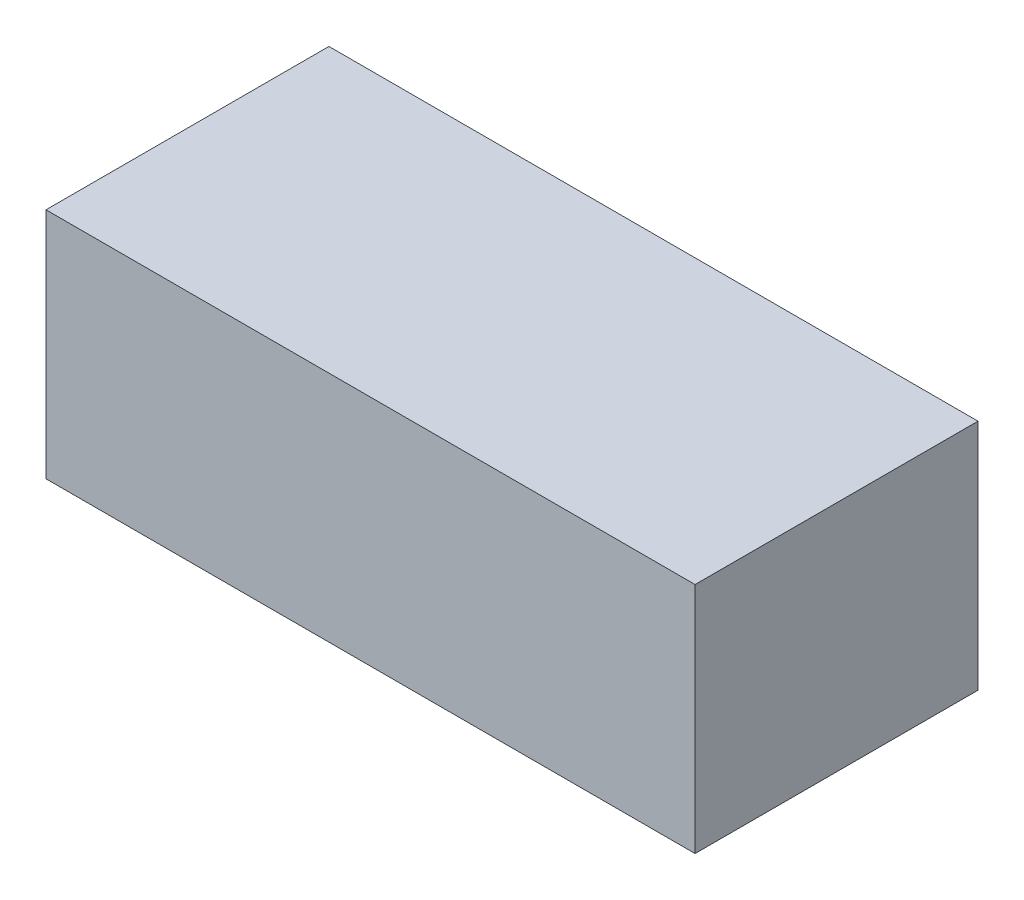
ISO-10303-21;
HEADER;
FILE_DESCRIPTION(('STEP AP214'),'2;1');
FILE_NAME('part.step','',(''),(''),'','','');
FILE_SCHEMA(('AUTOMOTIVE_DESIGN { 1 0 10303 214 1 1 1 1 }'));
ENDSEC;
DATA;
#1=APPLICATION_CONTEXT('core data for automotive mechanical design processes');
#2=APPLICATION_PROTOCOL_DEFINITION('international standard','automotive_design',2000,#1);
#3=PRODUCT_CONTEXT('',#1,'mechanical');
#4=PRODUCT('Part','Part','',(#3));
#5=PRODUCT_RELATED_PRODUCT_CATEGORY('part','',(#4));
#6=PRODUCT_DEFINITION_FORMATION('','',#4);
#7=PRODUCT_DEFINITION_CONTEXT('part definition',#1,'design');
#8=PRODUCT_DEFINITION('design','',#6,#7);
#9=PRODUCT_DEFINITION_SHAPE('','',#8);
#10=(LENGTH_UNIT() NAMED_UNIT(*) SI_UNIT(.MILLI.,.METRE.));
#11=(NAMED_UNIT(*) PLANE_ANGLE_UNIT() SI_UNIT($,.RADIAN.));
#12=(NAMED_UNIT(*) SI_UNIT($,.STERADIAN.) SOLID_ANGLE_UNIT());
#13=UNCERTAINTY_MEASURE_WITH_UNIT(LENGTH_MEASURE(1.E-05),#10,'distance_accuracy_value','');
#14=(GEOMETRIC_REPRESENTATION_CONTEXT(3) GLOBAL_UNCERTAINTY_ASSIGNED_CONTEXT((#13)) GLOBAL_UNIT_ASSIGNED_CONTEXT((#10,
#11,#12)) REPRESENTATION_CONTEXT('',''));
#15=CARTESIAN_POINT('',(0.,0.,0.));
#16=DIRECTION('',(0.,0.,1.));
#17=DIRECTION('',(1.,0.,0.));
#18=AXIS2_PLACEMENT_3D('',#15,#16,#17);
#19=CARTESIAN_POINT('',(-39.,28.,17.));
#20=DIRECTION('',(1.,0.,0.));
#21=DIRECTION('',(0.,0.,-1.));
#22=AXIS2_PLACEMENT_3D('',#19,#20,#21);
#23=PLANE('',#22);
#24=DIRECTION('',(0.,0.,1.));
#25=VECTOR('',#24,1.);
#26=CARTESIAN_POINT('',(-39.,0.,17.));
#27=LINE('',#26,#25);
#28=CARTESIAN_POINT('',(-39.,0.,-17.));
#29=VERTEX_POINT('',#28);
#30=CARTESIAN_POINT('',(-39.,0.,17.));
#31=VERTEX_POINT('',#30);
#32=EDGE_CURVE('E102',#29,#31,#27,.T.);
#33=ORIENTED_EDGE('',*,*,#32,.T.);
#34=DIRECTION('',(0.,-1.,0.));
#35=VECTOR('',#34,1.);
#36=CARTESIAN_POINT('',(-39.,28.,17.));
#37=LINE('',#36,#35);
#38=CARTESIAN_POINT('',(-39.,28.,17.));
#39=VERTEX_POINT('',#38);
#40=EDGE_CURVE('E11',#39,#31,#37,.T.);
#41=ORIENTED_EDGE('',*,*,#40,.F.);
#42=DIRECTION('',(0.,0.,1.));
#43=VECTOR('',#42,1.);
#44=CARTESIAN_POINT('',(-39.,28.,17.));
#45=LINE('',#44,#43);
#46=CARTESIAN_POINT('',(-39.,28.,-17.));
#47=VERTEX_POINT('',#46);
#48=EDGE_CURVE('E90',#47,#39,#45,.T.);
#49=ORIENTED_EDGE('',*,*,#48,.F.);
#50=DIRECTION('',(0.,-1.,0.));
#51=VECTOR('',#50,1.);
#52=CARTESIAN_POINT('',(-39.,28.,-17.));
#53=LINE('',#52,#51);
#54=EDGE_CURVE('E98',#47,#29,#53,.T.);
#55=ORIENTED_EDGE('',*,*,#54,.T.);
#56=EDGE_LOOP('',(#33,#41,#49,#55));
#57=FACE_BOUND('',#56,.T.);
#58=ADVANCED_FACE('F39',(#57),#23,.F.);
#59=CARTESIAN_POINT('',(39.,28.,17.));
#60=DIRECTION('',(0.,0.,-1.));
#61=DIRECTION('',(-1.,0.,0.));
#62=AXIS2_PLACEMENT_3D('',#59,#60,#61);
#63=PLANE('',#62);
#64=DIRECTION('',(1.,0.,0.));
#65=VECTOR('',#64,1.);
#66=CARTESIAN_POINT('',(39.,0.,17.));
#67=LINE('',#66,#65);
#68=CARTESIAN_POINT('',(39.,0.,17.));
#69=VERTEX_POINT('',#68);
#70=EDGE_CURVE('E94',#31,#69,#67,.T.);
#71=ORIENTED_EDGE('',*,*,#70,.T.);
#72=DIRECTION('',(0.,-1.,0.));
#73=VECTOR('',#72,1.);
#74=CARTESIAN_POINT('',(39.,28.,17.));
#75=LINE('',#74,#73);
#76=CARTESIAN_POINT('',(39.,28.,17.));
#77=VERTEX_POINT('',#76);
#78=EDGE_CURVE('E47',#77,#69,#75,.T.);
#79=ORIENTED_EDGE('',*,*,#78,.F.);
#80=DIRECTION('',(1.,0.,0.));
#81=VECTOR('',#80,1.);
#82=CARTESIAN_POINT('',(39.,28.,17.));
#83=LINE('',#82,#81);
#84=EDGE_CURVE('E85',#39,#77,#83,.T.);
#85=ORIENTED_EDGE('',*,*,#84,.F.);
#86=ORIENTED_EDGE('',*,*,#40,.T.);
#87=EDGE_LOOP('',(#71,#79,#85,#86));
#88=FACE_BOUND('',#87,.T.);
#89=ADVANCED_FACE('F93',(#88),#63,.F.);
#90=CARTESIAN_POINT('',(39.,28.,17.));
#91=DIRECTION('',(-1.,0.,0.));
#92=DIRECTION('',(0.,0.,1.));
#93=AXIS2_PLACEMENT_3D('',#90,#91,#92);
#94=PLANE('',#93);
#95=DIRECTION('',(0.,0.,-1.));
#96=VECTOR('',#95,1.);
#97=CARTESIAN_POINT('',(39.,0.,17.));
#98=LINE('',#97,#96);
#99=CARTESIAN_POINT('',(39.,0.,-17.));
#100=VERTEX_POINT('',#99);
#101=EDGE_CURVE('E72',#69,#100,#98,.T.);
#102=ORIENTED_EDGE('',*,*,#101,.T.);
#103=DIRECTION('',(0.,-1.,0.));
#104=VECTOR('',#103,1.);
#105=CARTESIAN_POINT('',(39.,28.,-17.));
#106=LINE('',#105,#104);
#107=CARTESIAN_POINT('',(39.,28.,-17.));
#108=VERTEX_POINT('',#107);
#109=EDGE_CURVE('E95',#108,#100,#106,.T.);
#110=ORIENTED_EDGE('',*,*,#109,.F.);
#111=DIRECTION('',(0.,0.,-1.));
#112=VECTOR('',#111,1.);
#113=CARTESIAN_POINT('',(39.,28.,17.));
#114=LINE('',#113,#112);
#115=EDGE_CURVE('E88',#77,#108,#114,.T.);
#116=ORIENTED_EDGE('',*,*,#115,.F.);
#117=ORIENTED_EDGE('',*,*,#78,.T.);
#118=EDGE_LOOP('',(#102,#110,#116,#117));
#119=FACE_BOUND('',#118,.T.);
#120=ADVANCED_FACE('F96',(#119),#94,.F.);
#121=CARTESIAN_POINT('',(39.,28.,-17.));
#122=DIRECTION('',(0.,0.,1.));
#123=DIRECTION('',(1.,0.,0.));
#124=AXIS2_PLACEMENT_3D('',#121,#122,#123);
#125=PLANE('',#124);
#126=DIRECTION('',(-1.,0.,0.));
#127=VECTOR('',#126,1.);
#128=CARTESIAN_POINT('',(39.,0.,-17.));
#129=LINE('',#128,#127);
#130=EDGE_CURVE('E78',#100,#29,#129,.T.);
#131=ORIENTED_EDGE('',*,*,#130,.T.);
#132=ORIENTED_EDGE('',*,*,#54,.F.);
#133=DIRECTION('',(-1.,0.,0.));
#134=VECTOR('',#133,1.);
#135=CARTESIAN_POINT('',(39.,28.,-17.));
#136=LINE('',#135,#134);
#137=EDGE_CURVE('E55',#108,#47,#136,.T.);
#138=ORIENTED_EDGE('',*,*,#137,.F.);
#139=ORIENTED_EDGE('',*,*,#109,.T.);
#140=EDGE_LOOP('',(#131,#132,#138,#139));
#141=FACE_BOUND('',#140,.T.);
#142=ADVANCED_FACE('F109',(#141),#125,.F.);
#143=CARTESIAN_POINT('',(0.,28.,0.));
#144=DIRECTION('',(0.,1.,0.));
#145=DIRECTION('',(0.,0.,1.));
#146=AXIS2_PLACEMENT_3D('',#143,#144,#145);
#147=PLANE('',#146);
#148=ORIENTED_EDGE('',*,*,#48,.T.);
#149=ORIENTED_EDGE('',*,*,#84,.T.);
#150=ORIENTED_EDGE('',*,*,#115,.T.);
#151=ORIENTED_EDGE('',*,*,#137,.T.);
#152=EDGE_LOOP('',(#148,#149,#150,#151));
#153=FACE_BOUND('',#152,.T.);
#154=ADVANCED_FACE('F86',(#153),#147,.T.);
#155=CARTESIAN_POINT('',(0.,0.,0.));
#156=DIRECTION('',(0.,1.,0.));
#157=DIRECTION('',(0.,0.,1.));
#158=AXIS2_PLACEMENT_3D('',#155,#156,#157);
#159=PLANE('',#158);
#160=ORIENTED_EDGE('',*,*,#32,.F.);
#161=ORIENTED_EDGE('',*,*,#130,.F.);
#162=ORIENTED_EDGE('',*,*,#101,.F.);
#163=ORIENTED_EDGE('',*,*,#70,.F.);
#164=EDGE_LOOP('',(#160,#161,#162,#163));
#165=FACE_BOUND('',#164,.T.);
#166=ADVANCED_FACE('F112',(#165),#159,.F.);
#167=CLOSED_SHELL('',(#58,#89,#120,#142,#154,#166));
#168=MANIFOLD_SOLID_BREP('B2',#167);
#169=ADVANCED_BREP_SHAPE_REPRESENTATION('',(#18,#168),#14);
#170=SHAPE_DEFINITION_REPRESENTATION(#9,#169);
ENDSEC;
END-ISO-10303-21;
